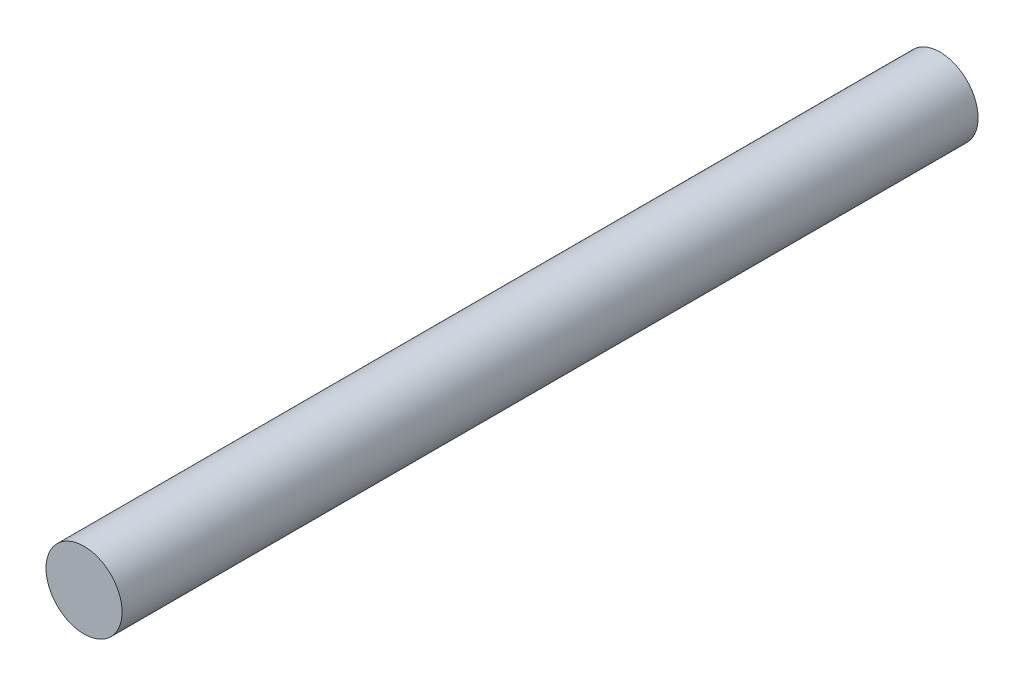
ISO-10303-21;
HEADER;
FILE_DESCRIPTION(('STEP AP214'),'2;1');
FILE_NAME('part.step','',(''),(''),'','','');
FILE_SCHEMA(('AUTOMOTIVE_DESIGN { 1 0 10303 214 1 1 1 1 }'));
ENDSEC;
DATA;
#1=APPLICATION_CONTEXT('core data for automotive mechanical design processes');
#2=APPLICATION_PROTOCOL_DEFINITION('international standard','automotive_design',2000,#1);
#3=PRODUCT_CONTEXT('',#1,'mechanical');
#4=PRODUCT('Part','Part','',(#3));
#5=PRODUCT_RELATED_PRODUCT_CATEGORY('part','',(#4));
#6=PRODUCT_DEFINITION_FORMATION('','',#4);
#7=PRODUCT_DEFINITION_CONTEXT('part definition',#1,'design');
#8=PRODUCT_DEFINITION('design','',#6,#7);
#9=PRODUCT_DEFINITION_SHAPE('','',#8);
#10=(LENGTH_UNIT() NAMED_UNIT(*) SI_UNIT(.MILLI.,.METRE.));
#11=(NAMED_UNIT(*) PLANE_ANGLE_UNIT() SI_UNIT($,.RADIAN.));
#12=(NAMED_UNIT(*) SI_UNIT($,.STERADIAN.) SOLID_ANGLE_UNIT());
#13=UNCERTAINTY_MEASURE_WITH_UNIT(LENGTH_MEASURE(1.E-05),#10,'distance_accuracy_value','');
#14=(GEOMETRIC_REPRESENTATION_CONTEXT(3) GLOBAL_UNCERTAINTY_ASSIGNED_CONTEXT((#13)) GLOBAL_UNIT_ASSIGNED_CONTEXT((#10,
#11,#12)) REPRESENTATION_CONTEXT('',''));
#15=CARTESIAN_POINT('',(0.,0.,0.));
#16=DIRECTION('',(0.,0.,1.));
#17=DIRECTION('',(1.,0.,0.));
#18=AXIS2_PLACEMENT_3D('',#15,#16,#17);
#19=CARTESIAN_POINT('',(0.,0.,45.));
#20=DIRECTION('',(0.,0.,-1.));
#21=DIRECTION('',(-1.,0.,0.));
#22=AXIS2_PLACEMENT_3D('',#19,#20,#21);
#23=CYLINDRICAL_SURFACE('',#22,2.);
#24=CARTESIAN_POINT('',(0.,0.,45.));
#25=DIRECTION('',(0.,0.,1.));
#26=DIRECTION('',(1.,0.,0.));
#27=AXIS2_PLACEMENT_3D('',#24,#25,#26);
#28=CIRCLE('',#27,2.);
#29=CARTESIAN_POINT('',(-2.,0.,45.));
#30=VERTEX_POINT('',#29);
#31=EDGE_CURVE('E10',#30,#30,#28,.T.);
#32=CARTESIAN_POINT('',(0.,0.,0.));
#33=DIRECTION('',(0.,0.,1.));
#34=DIRECTION('',(1.,0.,0.));
#35=AXIS2_PLACEMENT_3D('',#32,#33,#34);
#36=CIRCLE('',#35,2.);
#37=CARTESIAN_POINT('',(-2.,0.,0.));
#38=VERTEX_POINT('',#37);
#39=EDGE_CURVE('E35',#38,#38,#36,.T.);
#40=CARTESIAN_POINT('',(-2.,0.,45.));
#41=CARTESIAN_POINT('',(-2.,0.,44.53125));
#42=CARTESIAN_POINT('',(-2.,0.,44.0625));
#43=CARTESIAN_POINT('',(-2.,0.,43.125));
#44=CARTESIAN_POINT('',(-2.,0.,42.65625));
#45=CARTESIAN_POINT('',(-2.,0.,41.71875));
#46=CARTESIAN_POINT('',(-2.,0.,41.25));
#47=CARTESIAN_POINT('',(-2.,0.,40.3125));
#48=CARTESIAN_POINT('',(-2.,0.,39.84375));
#49=CARTESIAN_POINT('',(-2.,0.,38.90625));
#50=CARTESIAN_POINT('',(-2.,0.,38.4375));
#51=CARTESIAN_POINT('',(-2.,0.,37.5));
#52=CARTESIAN_POINT('',(-2.,0.,37.03125));
#53=CARTESIAN_POINT('',(-2.,0.,36.09375));
#54=CARTESIAN_POINT('',(-2.,0.,35.625));
#55=CARTESIAN_POINT('',(-2.,0.,34.6875));
#56=CARTESIAN_POINT('',(-2.,0.,34.21875));
#57=CARTESIAN_POINT('',(-2.,0.,33.28125));
#58=CARTESIAN_POINT('',(-2.,0.,32.8125));
#59=CARTESIAN_POINT('',(-2.,0.,31.875));
#60=CARTESIAN_POINT('',(-2.,0.,31.40625));
#61=CARTESIAN_POINT('',(-2.,0.,30.46875));
#62=CARTESIAN_POINT('',(-2.,0.,30.));
#63=CARTESIAN_POINT('',(-2.,0.,29.0625));
#64=CARTESIAN_POINT('',(-2.,0.,28.59375));
#65=CARTESIAN_POINT('',(-2.,0.,27.65625));
#66=CARTESIAN_POINT('',(-2.,0.,27.1875));
#67=CARTESIAN_POINT('',(-2.,0.,26.25));
#68=CARTESIAN_POINT('',(-2.,0.,25.78125));
#69=CARTESIAN_POINT('',(-2.,0.,24.84375));
#70=CARTESIAN_POINT('',(-2.,0.,24.375));
#71=CARTESIAN_POINT('',(-2.,0.,23.4375));
#72=CARTESIAN_POINT('',(-2.,0.,22.96875));
#73=CARTESIAN_POINT('',(-2.,0.,22.03125));
#74=CARTESIAN_POINT('',(-2.,0.,21.5625));
#75=CARTESIAN_POINT('',(-2.,0.,20.625));
#76=CARTESIAN_POINT('',(-2.,0.,20.15625));
#77=CARTESIAN_POINT('',(-2.,0.,19.21875));
#78=CARTESIAN_POINT('',(-2.,0.,18.75));
#79=CARTESIAN_POINT('',(-2.,0.,17.8125));
#80=CARTESIAN_POINT('',(-2.,0.,17.34375));
#81=CARTESIAN_POINT('',(-2.,0.,16.40625));
#82=CARTESIAN_POINT('',(-2.,0.,15.9375));
#83=CARTESIAN_POINT('',(-2.,0.,15.));
#84=CARTESIAN_POINT('',(-2.,0.,14.53125));
#85=CARTESIAN_POINT('',(-2.,0.,13.59375));
#86=CARTESIAN_POINT('',(-2.,0.,13.125));
#87=CARTESIAN_POINT('',(-2.,0.,12.1875));
#88=CARTESIAN_POINT('',(-2.,0.,11.71875));
#89=CARTESIAN_POINT('',(-2.,0.,10.78125));
#90=CARTESIAN_POINT('',(-2.,0.,10.3125));
#91=CARTESIAN_POINT('',(-2.,0.,9.37499999999999));
#92=CARTESIAN_POINT('',(-2.,0.,8.90624999999999));
#93=CARTESIAN_POINT('',(-2.,0.,7.96874999999999));
#94=CARTESIAN_POINT('',(-2.,0.,7.5));
#95=CARTESIAN_POINT('',(-2.,0.,6.56249999999999));
#96=CARTESIAN_POINT('',(-2.,0.,6.09374999999999));
#97=CARTESIAN_POINT('',(-2.,0.,5.15624999999999));
#98=CARTESIAN_POINT('',(-2.,0.,4.68749999999999));
#99=CARTESIAN_POINT('',(-2.,0.,3.74999999999999));
#100=CARTESIAN_POINT('',(-2.,0.,3.28124999999999));
#101=CARTESIAN_POINT('',(-2.,0.,2.34374999999999));
#102=CARTESIAN_POINT('',(-2.,0.,1.87499999999999));
#103=CARTESIAN_POINT('',(-2.,0.,0.937499999999992));
#104=CARTESIAN_POINT('',(-2.,0.,0.468749999999993));
#105=CARTESIAN_POINT('',(-2.,0.,0.));
#106=B_SPLINE_CURVE_WITH_KNOTS('',3,(#40,#41,#42,#43,#44,#45,#46,#47,#48,#49,#50,#51,#52,#53,
#54,#55,#56,#57,#58,#59,#60,#61,#62,#63,#64,#65,#66,#67,#68,#69,#70,#71,#72,#73,#74,#75,#76,#77,
#78,#79,#80,#81,#82,#83,#84,#85,#86,#87,#88,#89,#90,#91,#92,#93,#94,#95,#96,#97,#98,#99,#100,
#101,#102,#103,#104,#105),.UNSPECIFIED.,.F.,.F.,(4,2,2,2,2,2,2,2,2,2,2,2,2,2,2,2,2,2,2,2,2,2,2,
2,2,2,2,2,2,2,2,2,4),(0.,1.40625,2.8125,4.21874999999999,5.625,7.03125,8.43749999999999,9.84375,
11.25,12.65625,14.0625,15.46875,16.875,18.28125,19.6875,21.09375,22.5,23.90625,25.3125,26.71875,
28.125,29.53125,30.9375,32.34375,33.75,35.15625,36.5625,37.96875,39.375,40.78125,42.1875,
43.59375,45.),.UNSPECIFIED.);
#107=EDGE_CURVE('BSEAM32',#30,#38,#106,.T.);
#108=ORIENTED_EDGE('',*,*,#31,.F.);
#109=ORIENTED_EDGE('',*,*,#39,.T.);
#110=ORIENTED_EDGE('',*,*,#107,.T.);
#111=ORIENTED_EDGE('',*,*,#107,.F.);
#112=EDGE_LOOP('',(#108,#110,#109,#111));
#113=FACE_BOUND('',#112,.T.);
#114=ADVANCED_FACE('F32',(#113),#23,.T.);
#115=CARTESIAN_POINT('',(0.,0.,45.));
#116=DIRECTION('',(0.,0.,1.));
#117=DIRECTION('',(1.,0.,0.));
#118=AXIS2_PLACEMENT_3D('',#115,#116,#117);
#119=PLANE('',#118);
#120=ORIENTED_EDGE('',*,*,#31,.T.);
#121=EDGE_LOOP('',(#120));
#122=FACE_BOUND('',#121,.T.);
#123=ADVANCED_FACE('F47',(#122),#119,.T.);
#124=CARTESIAN_POINT('',(0.,0.,0.));
#125=DIRECTION('',(0.,0.,1.));
#126=DIRECTION('',(1.,0.,0.));
#127=AXIS2_PLACEMENT_3D('',#124,#125,#126);
#128=PLANE('',#127);
#129=ORIENTED_EDGE('',*,*,#39,.F.);
#130=EDGE_LOOP('',(#129));
#131=FACE_BOUND('',#130,.T.);
#132=ADVANCED_FACE('F45',(#131),#128,.F.);
#133=CLOSED_SHELL('',(#114,#123,#132));
#134=MANIFOLD_SOLID_BREP('B2',#133);
#135=ADVANCED_BREP_SHAPE_REPRESENTATION('',(#18,#134),#14);
#136=SHAPE_DEFINITION_REPRESENTATION(#9,#135);
ENDSEC;
END-ISO-10303-21;
